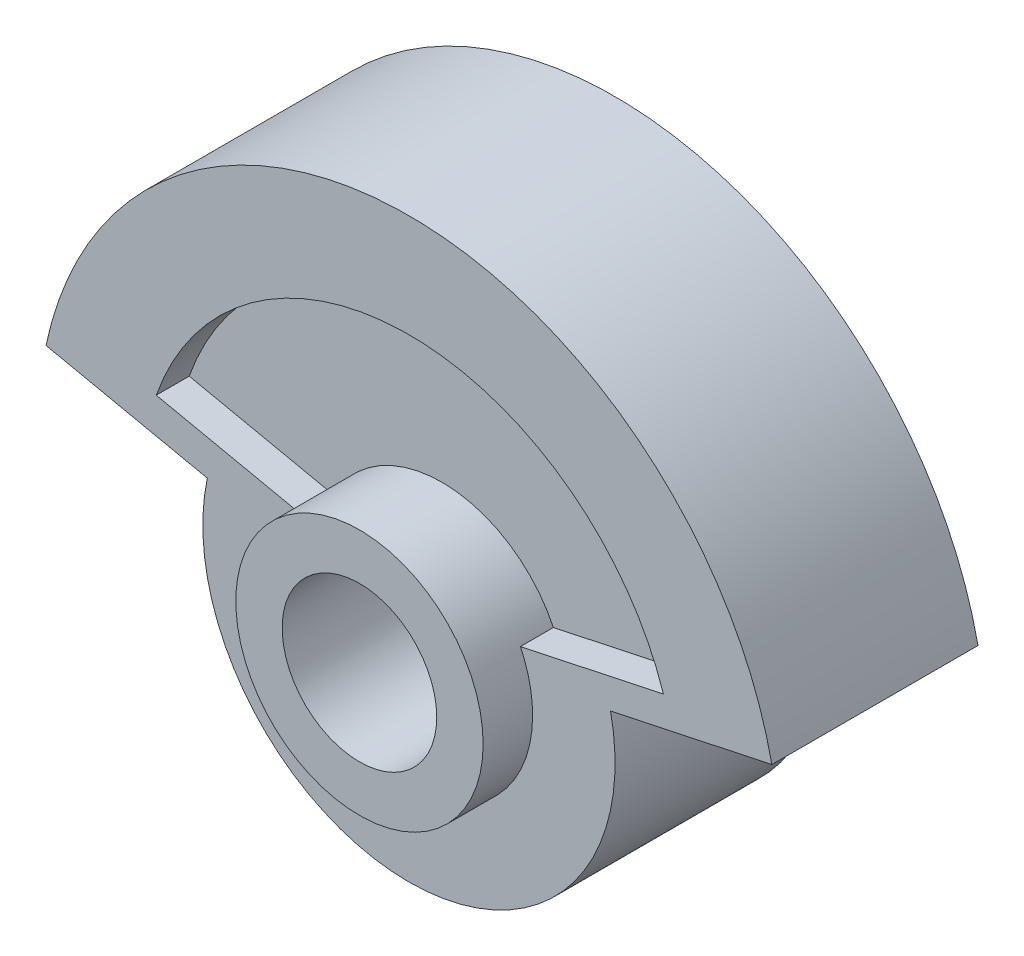
ISO-10303-21;
HEADER;
FILE_DESCRIPTION(('STEP AP214'),'2;1');
FILE_NAME('part.step','',(''),(''),'','','');
FILE_SCHEMA(('AUTOMOTIVE_DESIGN { 1 0 10303 214 1 1 1 1 }'));
ENDSEC;
DATA;
#1=APPLICATION_CONTEXT('core data for automotive mechanical design processes');
#2=APPLICATION_PROTOCOL_DEFINITION('international standard','automotive_design',2000,#1);
#3=PRODUCT_CONTEXT('',#1,'mechanical');
#4=PRODUCT('Part','Part','',(#3));
#5=PRODUCT_RELATED_PRODUCT_CATEGORY('part','',(#4));
#6=PRODUCT_DEFINITION_FORMATION('','',#4);
#7=PRODUCT_DEFINITION_CONTEXT('part definition',#1,'design');
#8=PRODUCT_DEFINITION('design','',#6,#7);
#9=PRODUCT_DEFINITION_SHAPE('','',#8);
#10=(LENGTH_UNIT() NAMED_UNIT(*) SI_UNIT(.MILLI.,.METRE.));
#11=(NAMED_UNIT(*) PLANE_ANGLE_UNIT() SI_UNIT($,.RADIAN.));
#12=(NAMED_UNIT(*) SI_UNIT($,.STERADIAN.) SOLID_ANGLE_UNIT());
#13=UNCERTAINTY_MEASURE_WITH_UNIT(LENGTH_MEASURE(1.E-05),#10,'distance_accuracy_value','');
#14=(GEOMETRIC_REPRESENTATION_CONTEXT(3) GLOBAL_UNCERTAINTY_ASSIGNED_CONTEXT((#13)) GLOBAL_UNIT_ASSIGNED_CONTEXT((#10,
#11,#12)) REPRESENTATION_CONTEXT('',''));
#15=CARTESIAN_POINT('',(0.,0.,0.));
#16=DIRECTION('',(0.,0.,1.));
#17=DIRECTION('',(1.,0.,0.));
#18=AXIS2_PLACEMENT_3D('',#15,#16,#17);
#19=CARTESIAN_POINT('',(0.,0.,6.2));
#20=DIRECTION('',(-0.207810990438505,-0.978168999842546,0.));
#21=DIRECTION('',(0.978168999842547,-0.207810990438505,0.));
#22=AXIS2_PLACEMENT_3D('',#19,#20,#21);
#23=PLANE('',#22);
#24=DIRECTION('',(0.,0.,-1.));
#25=VECTOR('',#24,1.);
#26=CARTESIAN_POINT('',(-4.89084499921273,1.03905495219253,6.2));
#27=LINE('',#26,#25);
#28=CARTESIAN_POINT('',(-4.89084499921273,1.03905495219253,5.));
#29=VERTEX_POINT('',#28);
#30=CARTESIAN_POINT('',(-4.89084499921273,1.03905495219253,0.));
#31=VERTEX_POINT('',#30);
#32=EDGE_CURVE('E47',#29,#31,#27,.T.);
#33=ORIENTED_EDGE('',*,*,#32,.F.);
#34=DIRECTION('',(-0.978168999842547,0.207810990438505,0.));
#35=VECTOR('',#34,1.);
#36=CARTESIAN_POINT('',(0.,0.,5.));
#37=LINE('',#36,#35);
#38=CARTESIAN_POINT('',(-8.80352099858292,1.87029891394655,5.));
#39=VERTEX_POINT('',#38);
#40=EDGE_CURVE('E187',#29,#39,#37,.T.);
#41=ORIENTED_EDGE('',*,*,#40,.T.);
#42=DIRECTION('',(0.,0.,-1.));
#43=VECTOR('',#42,1.);
#44=CARTESIAN_POINT('',(-8.80352099858292,1.87029891394655,6.2));
#45=LINE('',#44,#43);
#46=CARTESIAN_POINT('',(-8.80352099858292,1.87029891394655,0.));
#47=VERTEX_POINT('',#46);
#48=EDGE_CURVE('E151',#39,#47,#45,.T.);
#49=ORIENTED_EDGE('',*,*,#48,.T.);
#50=DIRECTION('',(-0.978168999842546,0.207810990438505,0.));
#51=VECTOR('',#50,1.);
#52=CARTESIAN_POINT('',(0.,0.,0.));
#53=LINE('',#52,#51);
#54=EDGE_CURVE('E139',#31,#47,#53,.T.);
#55=ORIENTED_EDGE('',*,*,#54,.F.);
#56=EDGE_LOOP('',(#33,#41,#49,#55));
#57=FACE_BOUND('',#56,.T.);
#58=ADVANCED_FACE('F40',(#57),#23,.T.);
#59=CARTESIAN_POINT('',(0.,0.,6.2));
#60=DIRECTION('',(0.,0.,-1.));
#61=DIRECTION('',(-1.,0.,0.));
#62=AXIS2_PLACEMENT_3D('',#59,#60,#61);
#63=CYLINDRICAL_SURFACE('',#62,5.);
#64=CARTESIAN_POINT('',(0.,0.,5.));
#65=DIRECTION('',(0.,0.,1.));
#66=DIRECTION('',(1.,0.,0.));
#67=AXIS2_PLACEMENT_3D('',#64,#65,#66);
#68=CIRCLE('',#67,5.);
#69=CARTESIAN_POINT('',(4.89084499921273,1.03905495219253,5.));
#70=VERTEX_POINT('',#69);
#71=EDGE_CURVE('E193',#29,#70,#68,.T.);
#72=ORIENTED_EDGE('',*,*,#71,.F.);
#73=ORIENTED_EDGE('',*,*,#32,.T.);
#74=CARTESIAN_POINT('',(0.,0.,0.));
#75=DIRECTION('',(0.,0.,1.));
#76=DIRECTION('',(1.,0.,0.));
#77=AXIS2_PLACEMENT_3D('',#74,#75,#76);
#78=CIRCLE('',#77,5.);
#79=CARTESIAN_POINT('',(4.89084499921273,1.03905495219253,0.));
#80=VERTEX_POINT('',#79);
#81=EDGE_CURVE('E142',#31,#80,#78,.T.);
#82=ORIENTED_EDGE('',*,*,#81,.T.);
#83=DIRECTION('',(0.,0.,-1.));
#84=VECTOR('',#83,1.);
#85=CARTESIAN_POINT('',(4.89084499921273,1.03905495219253,6.2));
#86=LINE('',#85,#84);
#87=EDGE_CURVE('E155',#70,#80,#86,.T.);
#88=ORIENTED_EDGE('',*,*,#87,.F.);
#89=EDGE_LOOP('',(#72,#73,#82,#88));
#90=FACE_BOUND('',#89,.T.);
#91=ADVANCED_FACE('F177',(#90),#63,.T.);
#92=CARTESIAN_POINT('',(0.,0.,6.2));
#93=DIRECTION('',(-0.207810990438505,0.978168999842546,0.));
#94=DIRECTION('',(-0.978168999842547,-0.207810990438505,0.));
#95=AXIS2_PLACEMENT_3D('',#92,#93,#94);
#96=PLANE('',#95);
#97=DIRECTION('',(0.978168999842547,0.207810990438505,0.));
#98=VECTOR('',#97,1.);
#99=CARTESIAN_POINT('',(0.,0.,5.));
#100=LINE('',#99,#98);
#101=CARTESIAN_POINT('',(8.80352099858292,1.87029891394655,5.));
#102=VERTEX_POINT('',#101);
#103=EDGE_CURVE('E54',#70,#102,#100,.T.);
#104=ORIENTED_EDGE('',*,*,#103,.F.);
#105=ORIENTED_EDGE('',*,*,#87,.T.);
#106=DIRECTION('',(0.978168999842546,0.207810990438505,0.));
#107=VECTOR('',#106,1.);
#108=CARTESIAN_POINT('',(0.,0.,0.));
#109=LINE('',#108,#107);
#110=CARTESIAN_POINT('',(8.80352099858292,1.87029891394655,0.));
#111=VERTEX_POINT('',#110);
#112=EDGE_CURVE('E145',#80,#111,#109,.T.);
#113=ORIENTED_EDGE('',*,*,#112,.T.);
#114=DIRECTION('',(0.,0.,-1.));
#115=VECTOR('',#114,1.);
#116=CARTESIAN_POINT('',(8.80352099858292,1.87029891394655,6.2));
#117=LINE('',#116,#115);
#118=EDGE_CURVE('E153',#102,#111,#117,.T.);
#119=ORIENTED_EDGE('',*,*,#118,.F.);
#120=EDGE_LOOP('',(#104,#105,#113,#119));
#121=FACE_BOUND('',#120,.T.);
#122=ADVANCED_FACE('F182',(#121),#96,.F.);
#123=CARTESIAN_POINT('',(0.,0.,6.2));
#124=DIRECTION('',(0.,0.,-1.));
#125=DIRECTION('',(-1.,0.,0.));
#126=AXIS2_PLACEMENT_3D('',#123,#124,#125);
#127=CYLINDRICAL_SURFACE('',#126,9.);
#128=CARTESIAN_POINT('',(0.,0.,5.));
#129=DIRECTION('',(0.,0.,1.));
#130=DIRECTION('',(1.,0.,0.));
#131=AXIS2_PLACEMENT_3D('',#128,#129,#130);
#132=CIRCLE('',#131,9.);
#133=EDGE_CURVE('E116',#102,#39,#132,.T.);
#134=ORIENTED_EDGE('',*,*,#133,.F.);
#135=ORIENTED_EDGE('',*,*,#118,.T.);
#136=CARTESIAN_POINT('',(0.,0.,0.));
#137=DIRECTION('',(0.,0.,1.));
#138=DIRECTION('',(1.,0.,0.));
#139=AXIS2_PLACEMENT_3D('',#136,#137,#138);
#140=CIRCLE('',#139,9.);
#141=EDGE_CURVE('E148',#111,#47,#140,.T.);
#142=ORIENTED_EDGE('',*,*,#141,.T.);
#143=ORIENTED_EDGE('',*,*,#48,.F.);
#144=EDGE_LOOP('',(#134,#135,#142,#143));
#145=FACE_BOUND('',#144,.T.);
#146=ADVANCED_FACE('F231',(#145),#127,.T.);
#147=CARTESIAN_POINT('',(0.,0.,6.2));
#148=DIRECTION('',(0.,0.,1.));
#149=DIRECTION('',(1.,0.,0.));
#150=AXIS2_PLACEMENT_3D('',#147,#148,#149);
#151=PLANE('',#150);
#152=CARTESIAN_POINT('',(0.,0.,6.2));
#153=DIRECTION('',(0.,0.,1.));
#154=DIRECTION('',(1.,0.,0.));
#155=AXIS2_PLACEMENT_3D('',#152,#153,#154);
#156=CIRCLE('',#155,1.875);
#157=CARTESIAN_POINT('',(1.875,0.,6.2));
#158=VERTEX_POINT('',#157);
#159=EDGE_CURVE('E123',#158,#158,#156,.T.);
#160=ORIENTED_EDGE('',*,*,#159,.F.);
#161=EDGE_LOOP('',(#160));
#162=FACE_BOUND('',#161,.T.);
#163=CARTESIAN_POINT('',(0.,0.,6.2));
#164=DIRECTION('',(0.,0.,-1.));
#165=DIRECTION('',(1.,0.,0.));
#166=AXIS2_PLACEMENT_3D('',#163,#164,#165);
#167=CIRCLE('',#166,3.);
#168=CARTESIAN_POINT('',(3.,0.,6.2));
#169=VERTEX_POINT('',#168);
#170=EDGE_CURVE('E131',#169,#169,#167,.T.);
#171=ORIENTED_EDGE('',*,*,#170,.F.);
#172=EDGE_LOOP('',(#171));
#173=FACE_BOUND('',#172,.T.);
#174=ADVANCED_FACE('F224',(#162,#173),#151,.T.);
#175=CARTESIAN_POINT('',(-2.64174873619418,1.4216763396837,4.2));
#176=DIRECTION('',(-0.207810990438505,-0.978168999842546,0.));
#177=DIRECTION('',(0.978168999842547,-0.207810990438505,0.));
#178=AXIS2_PLACEMENT_3D('',#175,#176,#177);
#179=PLANE('',#178);
#180=DIRECTION('',(-0.978168999842547,0.207810990438505,0.));
#181=VECTOR('',#180,1.);
#182=CARTESIAN_POINT('',(-2.64174873619418,1.4216763396837,5.));
#183=LINE('',#182,#181);
#184=CARTESIAN_POINT('',(-2.64174873619418,1.4216763396837,5.));
#185=VERTEX_POINT('',#184);
#186=CARTESIAN_POINT('',(-6.1296665091572,2.1626808563717,5.));
#187=VERTEX_POINT('',#186);
#188=EDGE_CURVE('E103',#185,#187,#183,.T.);
#189=ORIENTED_EDGE('',*,*,#188,.F.);
#190=DIRECTION('',(0.,0.,1.));
#191=VECTOR('',#190,1.);
#192=CARTESIAN_POINT('',(-2.64174873619418,1.4216763396837,4.2));
#193=LINE('',#192,#191);
#194=CARTESIAN_POINT('',(-2.64174873619418,1.4216763396837,4.2));
#195=VERTEX_POINT('',#194);
#196=EDGE_CURVE('E113',#195,#185,#193,.T.);
#197=ORIENTED_EDGE('',*,*,#196,.F.);
#198=DIRECTION('',(0.978168999842546,-0.207810990438505,0.));
#199=VECTOR('',#198,1.);
#200=CARTESIAN_POINT('',(-2.64174873619418,1.4216763396837,4.2));
#201=LINE('',#200,#199);
#202=CARTESIAN_POINT('',(-6.1296665091572,2.1626808563717,4.2));
#203=VERTEX_POINT('',#202);
#204=EDGE_CURVE('E137',#203,#195,#201,.T.);
#205=ORIENTED_EDGE('',*,*,#204,.F.);
#206=DIRECTION('',(0.,0.,1.));
#207=VECTOR('',#206,1.);
#208=CARTESIAN_POINT('',(-6.1296665091572,2.1626808563717,4.2));
#209=LINE('',#208,#207);
#210=EDGE_CURVE('E115',#203,#187,#209,.T.);
#211=ORIENTED_EDGE('',*,*,#210,.T.);
#212=EDGE_LOOP('',(#189,#197,#205,#211));
#213=FACE_BOUND('',#212,.T.);
#214=ADVANCED_FACE('F111',(#213),#179,.F.);
#215=CARTESIAN_POINT('',(0.,0.,4.2));
#216=DIRECTION('',(0.,0.,1.));
#217=DIRECTION('',(1.,0.,0.));
#218=AXIS2_PLACEMENT_3D('',#215,#216,#217);
#219=CYLINDRICAL_SURFACE('',#218,6.5);
#220=CARTESIAN_POINT('',(0.,0.,5.));
#221=DIRECTION('',(0.,0.,1.));
#222=DIRECTION('',(1.,0.,0.));
#223=AXIS2_PLACEMENT_3D('',#220,#221,#222);
#224=CIRCLE('',#223,6.5);
#225=CARTESIAN_POINT('',(6.17284229265068,2.03617730811026,5.));
#226=VERTEX_POINT('',#225);
#227=EDGE_CURVE('E107',#187,#226,#224,.F.);
#228=ORIENTED_EDGE('',*,*,#227,.F.);
#229=ORIENTED_EDGE('',*,*,#210,.F.);
#230=CARTESIAN_POINT('',(0.,0.,4.2));
#231=DIRECTION('',(0.,0.,1.));
#232=DIRECTION('',(1.,0.,0.));
#233=AXIS2_PLACEMENT_3D('',#230,#231,#232);
#234=CIRCLE('',#233,6.5);
#235=CARTESIAN_POINT('',(6.17284229265068,2.03617730811026,4.2));
#236=VERTEX_POINT('',#235);
#237=EDGE_CURVE('E206',#236,#203,#234,.T.);
#238=ORIENTED_EDGE('',*,*,#237,.F.);
#239=DIRECTION('',(0.,0.,1.));
#240=VECTOR('',#239,1.);
#241=CARTESIAN_POINT('',(6.17284229265068,2.03617730811026,4.2));
#242=LINE('',#241,#240);
#243=EDGE_CURVE('E128',#236,#226,#242,.T.);
#244=ORIENTED_EDGE('',*,*,#243,.T.);
#245=EDGE_LOOP('',(#228,#229,#238,#244));
#246=FACE_BOUND('',#245,.T.);
#247=ADVANCED_FACE('F212',(#246),#219,.F.);
#248=CARTESIAN_POINT('',(2.70406668848481,1.29923952534811,4.2));
#249=DIRECTION('',(0.207810990438505,-0.978168999842546,0.));
#250=DIRECTION('',(0.978168999842546,0.207810990438505,0.));
#251=AXIS2_PLACEMENT_3D('',#248,#249,#250);
#252=PLANE('',#251);
#253=DIRECTION('',(-0.978168999842546,-0.207810990438505,0.));
#254=VECTOR('',#253,1.);
#255=CARTESIAN_POINT('',(2.70406668848481,1.29923952534811,5.));
#256=LINE('',#255,#254);
#257=CARTESIAN_POINT('',(2.70406668848481,1.29923952534811,5.));
#258=VERTEX_POINT('',#257);
#259=EDGE_CURVE('E11',#226,#258,#256,.T.);
#260=ORIENTED_EDGE('',*,*,#259,.F.);
#261=ORIENTED_EDGE('',*,*,#243,.F.);
#262=DIRECTION('',(0.978168999842546,0.207810990438505,0.));
#263=VECTOR('',#262,1.);
#264=CARTESIAN_POINT('',(2.70406668848481,1.29923952534811,4.2));
#265=LINE('',#264,#263);
#266=CARTESIAN_POINT('',(2.70406668848481,1.29923952534811,4.2));
#267=VERTEX_POINT('',#266);
#268=EDGE_CURVE('E203',#267,#236,#265,.T.);
#269=ORIENTED_EDGE('',*,*,#268,.F.);
#270=DIRECTION('',(0.,0.,1.));
#271=VECTOR('',#270,1.);
#272=CARTESIAN_POINT('',(2.70406668848481,1.29923952534811,4.2));
#273=LINE('',#272,#271);
#274=EDGE_CURVE('E136',#267,#258,#273,.T.);
#275=ORIENTED_EDGE('',*,*,#274,.T.);
#276=EDGE_LOOP('',(#260,#261,#269,#275));
#277=FACE_BOUND('',#276,.T.);
#278=ADVANCED_FACE('F173',(#277),#252,.F.);
#279=CARTESIAN_POINT('',(0.,0.,0.));
#280=DIRECTION('',(0.,0.,1.));
#281=DIRECTION('',(1.,0.,0.));
#282=AXIS2_PLACEMENT_3D('',#279,#280,#281);
#283=PLANE('',#282);
#284=CARTESIAN_POINT('',(0.,0.,0.));
#285=DIRECTION('',(0.,0.,1.));
#286=DIRECTION('',(1.,0.,0.));
#287=AXIS2_PLACEMENT_3D('',#284,#285,#286);
#288=CIRCLE('',#287,1.875);
#289=CARTESIAN_POINT('',(1.875,0.,0.));
#290=VERTEX_POINT('',#289);
#291=EDGE_CURVE('E126',#290,#290,#288,.T.);
#292=ORIENTED_EDGE('',*,*,#291,.T.);
#293=EDGE_LOOP('',(#292));
#294=FACE_BOUND('',#293,.T.);
#295=ORIENTED_EDGE('',*,*,#54,.T.);
#296=ORIENTED_EDGE('',*,*,#141,.F.);
#297=ORIENTED_EDGE('',*,*,#112,.F.);
#298=ORIENTED_EDGE('',*,*,#81,.F.);
#299=EDGE_LOOP('',(#295,#296,#297,#298));
#300=FACE_BOUND('',#299,.T.);
#301=ADVANCED_FACE('F160',(#294,#300),#283,.F.);
#302=CARTESIAN_POINT('',(0.,0.,-3.8));
#303=DIRECTION('',(0.,0.,1.));
#304=DIRECTION('',(1.,0.,0.));
#305=AXIS2_PLACEMENT_3D('',#302,#303,#304);
#306=CYLINDRICAL_SURFACE('',#305,1.875);
#307=ORIENTED_EDGE('',*,*,#159,.T.);
#308=EDGE_LOOP('',(#307));
#309=FACE_BOUND('',#308,.T.);
#310=ORIENTED_EDGE('',*,*,#291,.F.);
#311=EDGE_LOOP('',(#310));
#312=FACE_BOUND('',#311,.T.);
#313=ADVANCED_FACE('F163',(#309,#312),#306,.F.);
#314=CARTESIAN_POINT('',(0.,0.,4.2));
#315=DIRECTION('',(0.,0.,1.));
#316=DIRECTION('',(1.,0.,0.));
#317=AXIS2_PLACEMENT_3D('',#314,#315,#316);
#318=CYLINDRICAL_SURFACE('',#317,3.);
#319=CARTESIAN_POINT('',(0.,0.,5.));
#320=DIRECTION('',(0.,0.,1.));
#321=DIRECTION('',(1.,0.,0.));
#322=AXIS2_PLACEMENT_3D('',#319,#320,#321);
#323=CIRCLE('',#322,3.);
#324=EDGE_CURVE('E62',#185,#258,#323,.T.);
#325=ORIENTED_EDGE('',*,*,#324,.T.);
#326=ORIENTED_EDGE('',*,*,#274,.F.);
#327=CARTESIAN_POINT('',(0.,0.,4.2));
#328=DIRECTION('',(0.,0.,-1.));
#329=DIRECTION('',(1.,0.,0.));
#330=AXIS2_PLACEMENT_3D('',#327,#328,#329);
#331=CIRCLE('',#330,3.);
#332=EDGE_CURVE('E121',#195,#267,#331,.T.);
#333=ORIENTED_EDGE('',*,*,#332,.F.);
#334=ORIENTED_EDGE('',*,*,#196,.T.);
#335=EDGE_LOOP('',(#325,#326,#333,#334));
#336=FACE_BOUND('',#335,.T.);
#337=ORIENTED_EDGE('',*,*,#170,.T.);
#338=EDGE_LOOP('',(#337));
#339=FACE_BOUND('',#338,.T.);
#340=ADVANCED_FACE('F118',(#336,#339),#318,.T.);
#341=CARTESIAN_POINT('',(0.,0.,4.2));
#342=DIRECTION('',(0.,0.,1.));
#343=DIRECTION('',(1.,0.,0.));
#344=AXIS2_PLACEMENT_3D('',#341,#342,#343);
#345=PLANE('',#344);
#346=ORIENTED_EDGE('',*,*,#332,.T.);
#347=ORIENTED_EDGE('',*,*,#268,.T.);
#348=ORIENTED_EDGE('',*,*,#237,.T.);
#349=ORIENTED_EDGE('',*,*,#204,.T.);
#350=EDGE_LOOP('',(#346,#347,#348,#349));
#351=FACE_BOUND('',#350,.T.);
#352=ADVANCED_FACE('F171',(#351),#345,.T.);
#353=CARTESIAN_POINT('',(0.,0.,5.));
#354=DIRECTION('',(0.,0.,1.));
#355=DIRECTION('',(1.,0.,0.));
#356=AXIS2_PLACEMENT_3D('',#353,#354,#355);
#357=PLANE('',#356);
#358=ORIENTED_EDGE('',*,*,#71,.T.);
#359=ORIENTED_EDGE('',*,*,#103,.T.);
#360=ORIENTED_EDGE('',*,*,#133,.T.);
#361=ORIENTED_EDGE('',*,*,#40,.F.);
#362=EDGE_LOOP('',(#358,#359,#360,#361));
#363=FACE_BOUND('',#362,.T.);
#364=ORIENTED_EDGE('',*,*,#188,.T.);
#365=ORIENTED_EDGE('',*,*,#227,.T.);
#366=ORIENTED_EDGE('',*,*,#259,.T.);
#367=ORIENTED_EDGE('',*,*,#324,.F.);
#368=EDGE_LOOP('',(#364,#365,#366,#367));
#369=FACE_BOUND('',#368,.T.);
#370=ADVANCED_FACE('F102',(#363,#369),#357,.T.);
#371=CLOSED_SHELL('',(#58,#91,#122,#146,#174,#214,#247,#278,#301,#313,#340,#352,#370));
#372=MANIFOLD_SOLID_BREP('B2',#371);
#373=ADVANCED_BREP_SHAPE_REPRESENTATION('',(#18,#372),#14);
#374=SHAPE_DEFINITION_REPRESENTATION(#9,#373);
ENDSEC;
END-ISO-10303-21;
